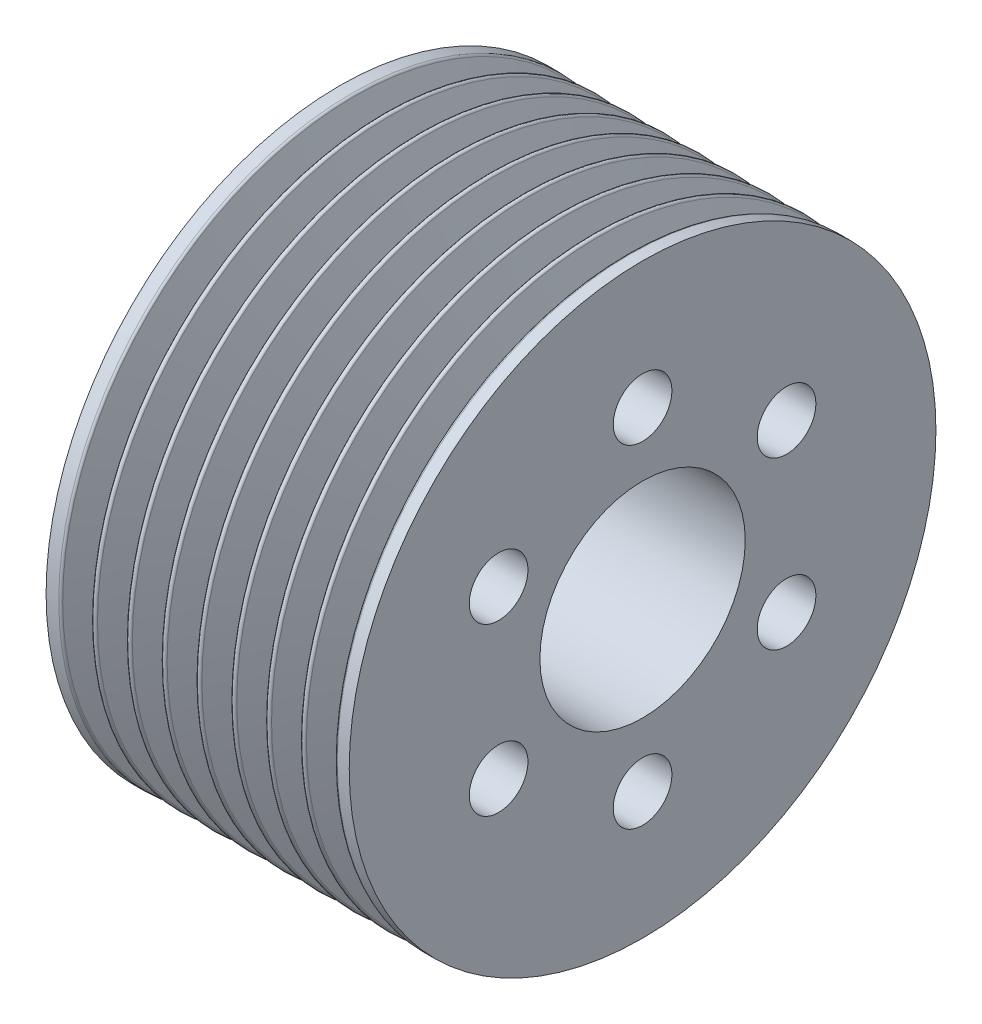
ISO-10303-21;
HEADER;
FILE_DESCRIPTION(('STEP AP214'),'2;1');
FILE_NAME('part.step','',(''),(''),'','','');
FILE_SCHEMA(('AUTOMOTIVE_DESIGN { 1 0 10303 214 1 1 1 1 }'));
ENDSEC;
DATA;
#1=APPLICATION_CONTEXT('core data for automotive mechanical design processes');
#2=APPLICATION_PROTOCOL_DEFINITION('international standard','automotive_design',2000,#1);
#3=PRODUCT_CONTEXT('',#1,'mechanical');
#4=PRODUCT('Part','Part','',(#3));
#5=PRODUCT_RELATED_PRODUCT_CATEGORY('part','',(#4));
#6=PRODUCT_DEFINITION_FORMATION('','',#4);
#7=PRODUCT_DEFINITION_CONTEXT('part definition',#1,'design');
#8=PRODUCT_DEFINITION('design','',#6,#7);
#9=PRODUCT_DEFINITION_SHAPE('','',#8);
#10=(LENGTH_UNIT() NAMED_UNIT(*) SI_UNIT(.MILLI.,.METRE.));
#11=(NAMED_UNIT(*) PLANE_ANGLE_UNIT() SI_UNIT($,.RADIAN.));
#12=(NAMED_UNIT(*) SI_UNIT($,.STERADIAN.) SOLID_ANGLE_UNIT());
#13=UNCERTAINTY_MEASURE_WITH_UNIT(LENGTH_MEASURE(1.E-05),#10,'distance_accuracy_value','');
#14=(GEOMETRIC_REPRESENTATION_CONTEXT(3) GLOBAL_UNCERTAINTY_ASSIGNED_CONTEXT((#13)) GLOBAL_UNIT_ASSIGNED_CONTEXT((#10,
#11,#12)) REPRESENTATION_CONTEXT('',''));
#15=CARTESIAN_POINT('',(0.,0.,0.));
#16=DIRECTION('',(0.,0.,1.));
#17=DIRECTION('',(1.,0.,0.));
#18=AXIS2_PLACEMENT_3D('',#15,#16,#17);
#19=CARTESIAN_POINT('',(0.,0.,0.));
#20=DIRECTION('',(-1.,0.,0.));
#21=DIRECTION('',(0.,0.,1.));
#22=AXIS2_PLACEMENT_3D('',#19,#20,#21);
#23=CYLINDRICAL_SURFACE('',#22,30.);
#24=CARTESIAN_POINT('',(18.,0.,0.));
#25=DIRECTION('',(-1.,0.,0.));
#26=DIRECTION('',(0.,0.,1.));
#27=AXIS2_PLACEMENT_3D('',#24,#25,#26);
#28=CIRCLE('',#27,30.);
#29=CARTESIAN_POINT('',(18.,0.,30.));
#30=VERTEX_POINT('',#29);
#31=EDGE_CURVE('E52',#30,#30,#28,.T.);
#32=ORIENTED_EDGE('',*,*,#31,.F.);
#33=EDGE_LOOP('',(#32));
#34=FACE_BOUND('',#33,.T.);
#35=CARTESIAN_POINT('',(19.3,0.,0.));
#36=DIRECTION('',(-1.,0.,0.));
#37=DIRECTION('',(0.,0.,1.));
#38=AXIS2_PLACEMENT_3D('',#35,#36,#37);
#39=CIRCLE('',#38,30.);
#40=CARTESIAN_POINT('',(19.3,0.,30.));
#41=VERTEX_POINT('',#40);
#42=EDGE_CURVE('E166',#41,#41,#39,.T.);
#43=ORIENTED_EDGE('',*,*,#42,.T.);
#44=EDGE_LOOP('',(#43));
#45=FACE_BOUND('',#44,.T.);
#46=ADVANCED_FACE('F41',(#34,#45),#23,.T.);
#47=CARTESIAN_POINT('',(31.5,10.5,0.));
#48=DIRECTION('',(1.,0.,0.));
#49=DIRECTION('',(0.,0.,-1.));
#50=AXIS2_PLACEMENT_3D('',#47,#48,#49);
#51=PLANE('',#50);
#52=CARTESIAN_POINT('',(31.5,8.50000000000017,14.7224318643354));
#53=DIRECTION('',(1.,0.,0.));
#54=DIRECTION('',(0.,0.,-1.));
#55=AXIS2_PLACEMENT_3D('',#52,#53,#54);
#56=CIRCLE('',#55,3.);
#57=CARTESIAN_POINT('',(31.5,8.50000000000017,11.7224318643354));
#58=VERTEX_POINT('',#57);
#59=EDGE_CURVE('E199',#58,#58,#56,.F.);
#60=ORIENTED_EDGE('',*,*,#59,.F.);
#61=EDGE_LOOP('',(#60));
#62=FACE_BOUND('',#61,.T.);
#63=CARTESIAN_POINT('',(31.5,-8.50000000000004,14.7224318643355));
#64=DIRECTION('',(1.,0.,0.));
#65=DIRECTION('',(0.,0.,-1.));
#66=AXIS2_PLACEMENT_3D('',#63,#64,#65);
#67=CIRCLE('',#66,3.);
#68=CARTESIAN_POINT('',(31.5,-8.50000000000004,11.7224318643355));
#69=VERTEX_POINT('',#68);
#70=EDGE_CURVE('E193',#69,#69,#67,.F.);
#71=ORIENTED_EDGE('',*,*,#70,.F.);
#72=EDGE_LOOP('',(#71));
#73=FACE_BOUND('',#72,.T.);
#74=CARTESIAN_POINT('',(31.5,-17.0000000000001,0.));
#75=DIRECTION('',(1.,0.,0.));
#76=DIRECTION('',(0.,0.,-1.));
#77=AXIS2_PLACEMENT_3D('',#74,#75,#76);
#78=CIRCLE('',#77,3.);
#79=CARTESIAN_POINT('',(31.5,-17.0000000000001,-2.99999999999996));
#80=VERTEX_POINT('',#79);
#81=EDGE_CURVE('E187',#80,#80,#78,.F.);
#82=ORIENTED_EDGE('',*,*,#81,.F.);
#83=EDGE_LOOP('',(#82));
#84=FACE_BOUND('',#83,.T.);
#85=CARTESIAN_POINT('',(31.5,-8.49999999999999,-14.7224318643355));
#86=DIRECTION('',(1.,0.,0.));
#87=DIRECTION('',(0.,0.,-1.));
#88=AXIS2_PLACEMENT_3D('',#85,#86,#87);
#89=CIRCLE('',#88,3.);
#90=CARTESIAN_POINT('',(31.5,-8.49999999999999,-17.7224318643355));
#91=VERTEX_POINT('',#90);
#92=EDGE_CURVE('E181',#91,#91,#89,.F.);
#93=ORIENTED_EDGE('',*,*,#92,.F.);
#94=EDGE_LOOP('',(#93));
#95=FACE_BOUND('',#94,.T.);
#96=CARTESIAN_POINT('',(31.5,8.5,-14.7224318643355));
#97=DIRECTION('',(1.,0.,0.));
#98=DIRECTION('',(0.,0.,-1.));
#99=AXIS2_PLACEMENT_3D('',#96,#97,#98);
#100=CIRCLE('',#99,3.);
#101=CARTESIAN_POINT('',(31.5,8.5,-17.7224318643355));
#102=VERTEX_POINT('',#101);
#103=EDGE_CURVE('E175',#102,#102,#100,.F.);
#104=ORIENTED_EDGE('',*,*,#103,.F.);
#105=EDGE_LOOP('',(#104));
#106=FACE_BOUND('',#105,.T.);
#107=CARTESIAN_POINT('',(31.5,17.,0.));
#108=DIRECTION('',(1.,0.,0.));
#109=DIRECTION('',(0.,0.,-1.));
#110=AXIS2_PLACEMENT_3D('',#107,#108,#109);
#111=CIRCLE('',#110,3.);
#112=CARTESIAN_POINT('',(31.5,17.,-3.));
#113=VERTEX_POINT('',#112);
#114=EDGE_CURVE('E169',#113,#113,#111,.F.);
#115=ORIENTED_EDGE('',*,*,#114,.F.);
#116=EDGE_LOOP('',(#115));
#117=FACE_BOUND('',#116,.T.);
#118=CARTESIAN_POINT('',(31.5,0.,0.));
#119=DIRECTION('',(-1.,0.,0.));
#120=DIRECTION('',(0.,0.,1.));
#121=AXIS2_PLACEMENT_3D('',#118,#119,#120);
#122=CIRCLE('',#121,10.5);
#123=CARTESIAN_POINT('',(31.5,0.,10.5));
#124=VERTEX_POINT('',#123);
#125=EDGE_CURVE('E64',#124,#124,#122,.T.);
#126=ORIENTED_EDGE('',*,*,#125,.F.);
#127=EDGE_LOOP('',(#126));
#128=FACE_BOUND('',#127,.T.);
#129=CARTESIAN_POINT('',(31.5,0.,0.));
#130=DIRECTION('',(-1.,0.,0.));
#131=DIRECTION('',(0.,0.,1.));
#132=AXIS2_PLACEMENT_3D('',#129,#130,#131);
#133=CIRCLE('',#132,21.5);
#134=CARTESIAN_POINT('',(31.5,0.,21.5));
#135=VERTEX_POINT('',#134);
#136=EDGE_CURVE('E10',#135,#135,#133,.T.);
#137=ORIENTED_EDGE('',*,*,#136,.T.);
#138=EDGE_LOOP('',(#137));
#139=FACE_BOUND('',#138,.T.);
#140=ADVANCED_FACE('F43',(#62,#73,#84,#95,#106,#117,#128,#139),#51,.F.);
#141=CARTESIAN_POINT('',(0.,0.,0.));
#142=DIRECTION('',(-1.,0.,0.));
#143=DIRECTION('',(0.,0.,1.));
#144=AXIS2_PLACEMENT_3D('',#141,#142,#143);
#145=CYLINDRICAL_SURFACE('',#144,21.5);
#146=ORIENTED_EDGE('',*,*,#136,.F.);
#147=EDGE_LOOP('',(#146));
#148=FACE_BOUND('',#147,.T.);
#149=CARTESIAN_POINT('',(18.,0.,0.));
#150=DIRECTION('',(-1.,0.,0.));
#151=DIRECTION('',(0.,0.,1.));
#152=AXIS2_PLACEMENT_3D('',#149,#150,#151);
#153=CIRCLE('',#152,21.5);
#154=CARTESIAN_POINT('',(18.,0.,21.5));
#155=VERTEX_POINT('',#154);
#156=EDGE_CURVE('E48',#155,#155,#153,.T.);
#157=ORIENTED_EDGE('',*,*,#156,.T.);
#158=EDGE_LOOP('',(#157));
#159=FACE_BOUND('',#158,.T.);
#160=ADVANCED_FACE('F235',(#148,#159),#145,.F.);
#161=CARTESIAN_POINT('',(18.,30.,0.));
#162=DIRECTION('',(1.,0.,0.));
#163=DIRECTION('',(0.,0.,-1.));
#164=AXIS2_PLACEMENT_3D('',#161,#162,#163);
#165=PLANE('',#164);
#166=ORIENTED_EDGE('',*,*,#156,.F.);
#167=EDGE_LOOP('',(#166));
#168=FACE_BOUND('',#167,.T.);
#169=ORIENTED_EDGE('',*,*,#31,.T.);
#170=EDGE_LOOP('',(#169));
#171=FACE_BOUND('',#170,.T.);
#172=ADVANCED_FACE('F241',(#168,#171),#165,.F.);
#173=CARTESIAN_POINT('',(47.78,0.,0.));
#174=DIRECTION('',(-1.,0.,0.));
#175=DIRECTION('',(0.,0.,1.));
#176=AXIS2_PLACEMENT_3D('',#173,#174,#175);
#177=CIRCLE('',#176,30.);
#178=CARTESIAN_POINT('',(47.78,0.,30.));
#179=VERTEX_POINT('',#178);
#180=EDGE_CURVE('E79',#179,#179,#177,.T.);
#181=ORIENTED_EDGE('',*,*,#180,.F.);
#182=EDGE_LOOP('',(#181));
#183=FACE_BOUND('',#182,.T.);
#184=CARTESIAN_POINT('',(49.,0.,0.));
#185=DIRECTION('',(-1.,0.,0.));
#186=DIRECTION('',(0.,0.,1.));
#187=AXIS2_PLACEMENT_3D('',#184,#185,#186);
#188=CIRCLE('',#187,30.);
#189=CARTESIAN_POINT('',(49.,0.,30.));
#190=VERTEX_POINT('',#189);
#191=EDGE_CURVE('E56',#190,#190,#188,.T.);
#192=ORIENTED_EDGE('',*,*,#191,.T.);
#193=EDGE_LOOP('',(#192));
#194=FACE_BOUND('',#193,.T.);
#195=ADVANCED_FACE('F212',(#183,#194),#23,.T.);
#196=CARTESIAN_POINT('',(49.,10.5,0.));
#197=DIRECTION('',(-1.,0.,0.));
#198=DIRECTION('',(0.,0.,1.));
#199=AXIS2_PLACEMENT_3D('',#196,#197,#198);
#200=PLANE('',#199);
#201=CARTESIAN_POINT('',(49.,8.50000000000017,14.7224318643354));
#202=DIRECTION('',(1.,0.,0.));
#203=DIRECTION('',(0.,0.,-1.));
#204=AXIS2_PLACEMENT_3D('',#201,#202,#203);
#205=CIRCLE('',#204,3.);
#206=CARTESIAN_POINT('',(49.,8.50000000000017,11.7224318643354));
#207=VERTEX_POINT('',#206);
#208=EDGE_CURVE('E202',#207,#207,#205,.T.);
#209=ORIENTED_EDGE('',*,*,#208,.F.);
#210=EDGE_LOOP('',(#209));
#211=FACE_BOUND('',#210,.T.);
#212=CARTESIAN_POINT('',(49.,-8.50000000000004,14.7224318643355));
#213=DIRECTION('',(1.,0.,0.));
#214=DIRECTION('',(0.,0.,-1.));
#215=AXIS2_PLACEMENT_3D('',#212,#213,#214);
#216=CIRCLE('',#215,3.);
#217=CARTESIAN_POINT('',(49.,-8.50000000000004,11.7224318643355));
#218=VERTEX_POINT('',#217);
#219=EDGE_CURVE('E196',#218,#218,#216,.T.);
#220=ORIENTED_EDGE('',*,*,#219,.F.);
#221=EDGE_LOOP('',(#220));
#222=FACE_BOUND('',#221,.T.);
#223=CARTESIAN_POINT('',(49.,-17.0000000000001,0.));
#224=DIRECTION('',(1.,0.,0.));
#225=DIRECTION('',(0.,0.,-1.));
#226=AXIS2_PLACEMENT_3D('',#223,#224,#225);
#227=CIRCLE('',#226,3.);
#228=CARTESIAN_POINT('',(49.,-17.0000000000001,-2.99999999999996));
#229=VERTEX_POINT('',#228);
#230=EDGE_CURVE('E190',#229,#229,#227,.T.);
#231=ORIENTED_EDGE('',*,*,#230,.F.);
#232=EDGE_LOOP('',(#231));
#233=FACE_BOUND('',#232,.T.);
#234=CARTESIAN_POINT('',(49.,-8.49999999999999,-14.7224318643355));
#235=DIRECTION('',(1.,0.,0.));
#236=DIRECTION('',(0.,0.,-1.));
#237=AXIS2_PLACEMENT_3D('',#234,#235,#236);
#238=CIRCLE('',#237,3.);
#239=CARTESIAN_POINT('',(49.,-8.49999999999999,-17.7224318643355));
#240=VERTEX_POINT('',#239);
#241=EDGE_CURVE('E184',#240,#240,#238,.T.);
#242=ORIENTED_EDGE('',*,*,#241,.F.);
#243=EDGE_LOOP('',(#242));
#244=FACE_BOUND('',#243,.T.);
#245=CARTESIAN_POINT('',(49.,8.5,-14.7224318643355));
#246=DIRECTION('',(1.,0.,0.));
#247=DIRECTION('',(0.,0.,-1.));
#248=AXIS2_PLACEMENT_3D('',#245,#246,#247);
#249=CIRCLE('',#248,3.);
#250=CARTESIAN_POINT('',(49.,8.5,-17.7224318643355));
#251=VERTEX_POINT('',#250);
#252=EDGE_CURVE('E178',#251,#251,#249,.T.);
#253=ORIENTED_EDGE('',*,*,#252,.F.);
#254=EDGE_LOOP('',(#253));
#255=FACE_BOUND('',#254,.T.);
#256=CARTESIAN_POINT('',(49.,17.,0.));
#257=DIRECTION('',(1.,0.,0.));
#258=DIRECTION('',(0.,0.,-1.));
#259=AXIS2_PLACEMENT_3D('',#256,#257,#258);
#260=CIRCLE('',#259,3.);
#261=CARTESIAN_POINT('',(49.,17.,-3.));
#262=VERTEX_POINT('',#261);
#263=EDGE_CURVE('E172',#262,#262,#260,.T.);
#264=ORIENTED_EDGE('',*,*,#263,.F.);
#265=EDGE_LOOP('',(#264));
#266=FACE_BOUND('',#265,.T.);
#267=ORIENTED_EDGE('',*,*,#191,.F.);
#268=EDGE_LOOP('',(#267));
#269=FACE_BOUND('',#268,.T.);
#270=CARTESIAN_POINT('',(49.,0.,0.));
#271=DIRECTION('',(-1.,0.,0.));
#272=DIRECTION('',(0.,0.,1.));
#273=AXIS2_PLACEMENT_3D('',#270,#271,#272);
#274=CIRCLE('',#273,10.5);
#275=CARTESIAN_POINT('',(49.,0.,10.5));
#276=VERTEX_POINT('',#275);
#277=EDGE_CURVE('E61',#276,#276,#274,.T.);
#278=ORIENTED_EDGE('',*,*,#277,.T.);
#279=EDGE_LOOP('',(#278));
#280=FACE_BOUND('',#279,.T.);
#281=ADVANCED_FACE('F208',(#211,#222,#233,#244,#255,#266,#269,#280),#200,.F.);
#282=CARTESIAN_POINT('',(0.,0.,0.));
#283=DIRECTION('',(-1.,0.,0.));
#284=DIRECTION('',(0.,0.,1.));
#285=AXIS2_PLACEMENT_3D('',#282,#283,#284);
#286=CYLINDRICAL_SURFACE('',#285,10.5);
#287=ORIENTED_EDGE('',*,*,#277,.F.);
#288=EDGE_LOOP('',(#287));
#289=FACE_BOUND('',#288,.T.);
#290=ORIENTED_EDGE('',*,*,#125,.T.);
#291=EDGE_LOOP('',(#290));
#292=FACE_BOUND('',#291,.T.);
#293=ADVANCED_FACE('F211',(#289,#292),#286,.F.);
#294=CARTESIAN_POINT('',(47.78,0.,0.));
#295=DIRECTION('',(-1.,0.,0.));
#296=DIRECTION('',(0.,0.,1.));
#297=AXIS2_PLACEMENT_3D('',#294,#295,#296);
#298=TOROIDAL_SURFACE('',#297,29.75,0.249999999999999);
#299=ORIENTED_EDGE('',*,*,#180,.T.);
#300=EDGE_LOOP('',(#299));
#301=FACE_BOUND('',#300,.T.);
#302=CARTESIAN_POINT('',(47.5450768448035,0.,0.));
#303=DIRECTION('',(-1.,0.,0.));
#304=DIRECTION('',(0.,0.,1.));
#305=AXIS2_PLACEMENT_3D('',#302,#303,#304);
#306=CIRCLE('',#305,29.8355050358314);
#307=CARTESIAN_POINT('',(47.5450768448035,0.,29.8355050358314));
#308=VERTEX_POINT('',#307);
#309=EDGE_CURVE('E67',#308,#308,#306,.T.);
#310=ORIENTED_EDGE('',*,*,#309,.F.);
#311=EDGE_LOOP('',(#310));
#312=FACE_BOUND('',#311,.T.);
#313=ADVANCED_FACE('F230',(#301,#312),#298,.T.);
#314=CARTESIAN_POINT('',(46.2819077862358,0.,0.));
#315=DIRECTION('',(1.,0.,0.));
#316=DIRECTION('',(0.,0.,-1.));
#317=AXIS2_PLACEMENT_3D('',#314,#315,#316);
#318=CONICAL_SURFACE('',#317,26.3649765704627,1.22173047639603);
#319=ORIENTED_EDGE('',*,*,#309,.T.);
#320=EDGE_LOOP('',(#319));
#321=FACE_BOUND('',#320,.T.);
#322=CARTESIAN_POINT('',(46.2819077862358,0.,0.));
#323=DIRECTION('',(-1.,0.,0.));
#324=DIRECTION('',(0.,0.,1.));
#325=AXIS2_PLACEMENT_3D('',#322,#323,#324);
#326=CIRCLE('',#325,26.3649765704627);
#327=CARTESIAN_POINT('',(46.2819077862358,0.,26.3649765704627));
#328=VERTEX_POINT('',#327);
#329=EDGE_CURVE('E70',#328,#328,#326,.T.);
#330=ORIENTED_EDGE('',*,*,#329,.F.);
#331=EDGE_LOOP('',(#330));
#332=FACE_BOUND('',#331,.T.);
#333=ADVANCED_FACE('F393',(#321,#332),#318,.T.);
#334=CARTESIAN_POINT('',(46.,0.,0.));
#335=DIRECTION('',(-1.,0.,0.));
#336=DIRECTION('',(0.,0.,1.));
#337=AXIS2_PLACEMENT_3D('',#334,#335,#336);
#338=TOROIDAL_SURFACE('',#337,26.4675826134604,0.3);
#339=ORIENTED_EDGE('',*,*,#329,.T.);
#340=EDGE_LOOP('',(#339));
#341=FACE_BOUND('',#340,.T.);
#342=CARTESIAN_POINT('',(45.7180922137642,0.,0.));
#343=DIRECTION('',(-1.,0.,0.));
#344=DIRECTION('',(0.,0.,1.));
#345=AXIS2_PLACEMENT_3D('',#342,#343,#344);
#346=CIRCLE('',#345,26.3649765704627);
#347=CARTESIAN_POINT('',(45.7180922137642,0.,26.3649765704627));
#348=VERTEX_POINT('',#347);
#349=EDGE_CURVE('E73',#348,#348,#346,.T.);
#350=ORIENTED_EDGE('',*,*,#349,.F.);
#351=EDGE_LOOP('',(#350));
#352=FACE_BOUND('',#351,.T.);
#353=ADVANCED_FACE('F389',(#341,#352),#338,.F.);
#354=CARTESIAN_POINT('',(44.4549231551965,0.,0.));
#355=DIRECTION('',(-1.,0.,0.));
#356=DIRECTION('',(0.,0.,1.));
#357=AXIS2_PLACEMENT_3D('',#354,#355,#356);
#358=CONICAL_SURFACE('',#357,29.8355050358314,1.22173047639604);
#359=ORIENTED_EDGE('',*,*,#349,.T.);
#360=EDGE_LOOP('',(#359));
#361=FACE_BOUND('',#360,.T.);
#362=CARTESIAN_POINT('',(44.4549231551965,0.,0.));
#363=DIRECTION('',(-1.,0.,0.));
#364=DIRECTION('',(0.,0.,1.));
#365=AXIS2_PLACEMENT_3D('',#362,#363,#364);
#366=CIRCLE('',#365,29.8355050358314);
#367=CARTESIAN_POINT('',(44.4549231551965,0.,29.8355050358314));
#368=VERTEX_POINT('',#367);
#369=EDGE_CURVE('E76',#368,#368,#366,.T.);
#370=ORIENTED_EDGE('',*,*,#369,.F.);
#371=EDGE_LOOP('',(#370));
#372=FACE_BOUND('',#371,.T.);
#373=ADVANCED_FACE('F385',(#361,#372),#358,.T.);
#374=CARTESIAN_POINT('',(44.22,0.,0.));
#375=DIRECTION('',(-1.,0.,0.));
#376=DIRECTION('',(0.,0.,1.));
#377=AXIS2_PLACEMENT_3D('',#374,#375,#376);
#378=TOROIDAL_SURFACE('',#377,29.75,0.250000000000001);
#379=ORIENTED_EDGE('',*,*,#369,.T.);
#380=EDGE_LOOP('',(#379));
#381=FACE_BOUND('',#380,.T.);
#382=CARTESIAN_POINT('',(43.9850768448035,0.,0.));
#383=DIRECTION('',(-1.,0.,0.));
#384=DIRECTION('',(0.,0.,1.));
#385=AXIS2_PLACEMENT_3D('',#382,#383,#384);
#386=CIRCLE('',#385,29.8355050358314);
#387=CARTESIAN_POINT('',(43.9850768448035,0.,29.8355050358314));
#388=VERTEX_POINT('',#387);
#389=EDGE_CURVE('E82',#388,#388,#386,.T.);
#390=ORIENTED_EDGE('',*,*,#389,.F.);
#391=EDGE_LOOP('',(#390));
#392=FACE_BOUND('',#391,.T.);
#393=ADVANCED_FACE('F381',(#381,#392),#378,.T.);
#394=CARTESIAN_POINT('',(42.7219077862358,0.,0.));
#395=DIRECTION('',(1.,0.,0.));
#396=DIRECTION('',(0.,0.,-1.));
#397=AXIS2_PLACEMENT_3D('',#394,#395,#396);
#398=CONICAL_SURFACE('',#397,26.3649765704627,1.22173047639603);
#399=ORIENTED_EDGE('',*,*,#389,.T.);
#400=EDGE_LOOP('',(#399));
#401=FACE_BOUND('',#400,.T.);
#402=CARTESIAN_POINT('',(42.7219077862358,0.,0.));
#403=DIRECTION('',(-1.,0.,0.));
#404=DIRECTION('',(0.,0.,1.));
#405=AXIS2_PLACEMENT_3D('',#402,#403,#404);
#406=CIRCLE('',#405,26.3649765704627);
#407=CARTESIAN_POINT('',(42.7219077862358,0.,26.3649765704627));
#408=VERTEX_POINT('',#407);
#409=EDGE_CURVE('E85',#408,#408,#406,.T.);
#410=ORIENTED_EDGE('',*,*,#409,.F.);
#411=EDGE_LOOP('',(#410));
#412=FACE_BOUND('',#411,.T.);
#413=ADVANCED_FACE('F377',(#401,#412),#398,.T.);
#414=CARTESIAN_POINT('',(42.44,0.,0.));
#415=DIRECTION('',(-1.,0.,0.));
#416=DIRECTION('',(0.,0.,1.));
#417=AXIS2_PLACEMENT_3D('',#414,#415,#416);
#418=TOROIDAL_SURFACE('',#417,26.4675826134604,0.3);
#419=ORIENTED_EDGE('',*,*,#409,.T.);
#420=EDGE_LOOP('',(#419));
#421=FACE_BOUND('',#420,.T.);
#422=CARTESIAN_POINT('',(42.1580922137642,0.,0.));
#423=DIRECTION('',(-1.,0.,0.));
#424=DIRECTION('',(0.,0.,1.));
#425=AXIS2_PLACEMENT_3D('',#422,#423,#424);
#426=CIRCLE('',#425,26.3649765704627);
#427=CARTESIAN_POINT('',(42.1580922137642,0.,26.3649765704627));
#428=VERTEX_POINT('',#427);
#429=EDGE_CURVE('E88',#428,#428,#426,.T.);
#430=ORIENTED_EDGE('',*,*,#429,.F.);
#431=EDGE_LOOP('',(#430));
#432=FACE_BOUND('',#431,.T.);
#433=ADVANCED_FACE('F373',(#421,#432),#418,.F.);
#434=CARTESIAN_POINT('',(40.8949231551965,0.,0.));
#435=DIRECTION('',(-1.,0.,0.));
#436=DIRECTION('',(0.,0.,1.));
#437=AXIS2_PLACEMENT_3D('',#434,#435,#436);
#438=CONICAL_SURFACE('',#437,29.8355050358314,1.22173047639604);
#439=ORIENTED_EDGE('',*,*,#429,.T.);
#440=EDGE_LOOP('',(#439));
#441=FACE_BOUND('',#440,.T.);
#442=CARTESIAN_POINT('',(40.8949231551965,0.,0.));
#443=DIRECTION('',(-1.,0.,0.));
#444=DIRECTION('',(0.,0.,1.));
#445=AXIS2_PLACEMENT_3D('',#442,#443,#444);
#446=CIRCLE('',#445,29.8355050358314);
#447=CARTESIAN_POINT('',(40.8949231551965,0.,29.8355050358314));
#448=VERTEX_POINT('',#447);
#449=EDGE_CURVE('E91',#448,#448,#446,.T.);
#450=ORIENTED_EDGE('',*,*,#449,.F.);
#451=EDGE_LOOP('',(#450));
#452=FACE_BOUND('',#451,.T.);
#453=ADVANCED_FACE('F369',(#441,#452),#438,.T.);
#454=CARTESIAN_POINT('',(40.66,0.,0.));
#455=DIRECTION('',(-1.,0.,0.));
#456=DIRECTION('',(0.,0.,1.));
#457=AXIS2_PLACEMENT_3D('',#454,#455,#456);
#458=TOROIDAL_SURFACE('',#457,29.75,0.250000000000001);
#459=ORIENTED_EDGE('',*,*,#449,.T.);
#460=EDGE_LOOP('',(#459));
#461=FACE_BOUND('',#460,.T.);
#462=CARTESIAN_POINT('',(40.4250768448035,0.,0.));
#463=DIRECTION('',(-1.,0.,0.));
#464=DIRECTION('',(0.,0.,1.));
#465=AXIS2_PLACEMENT_3D('',#462,#463,#464);
#466=CIRCLE('',#465,29.8355050358314);
#467=CARTESIAN_POINT('',(40.4250768448035,0.,29.8355050358314));
#468=VERTEX_POINT('',#467);
#469=EDGE_CURVE('E94',#468,#468,#466,.T.);
#470=ORIENTED_EDGE('',*,*,#469,.F.);
#471=EDGE_LOOP('',(#470));
#472=FACE_BOUND('',#471,.T.);
#473=ADVANCED_FACE('F365',(#461,#472),#458,.T.);
#474=CARTESIAN_POINT('',(39.1619077862358,0.,0.));
#475=DIRECTION('',(1.,0.,0.));
#476=DIRECTION('',(0.,0.,-1.));
#477=AXIS2_PLACEMENT_3D('',#474,#475,#476);
#478=CONICAL_SURFACE('',#477,26.3649765704627,1.22173047639603);
#479=ORIENTED_EDGE('',*,*,#469,.T.);
#480=EDGE_LOOP('',(#479));
#481=FACE_BOUND('',#480,.T.);
#482=CARTESIAN_POINT('',(39.1619077862358,0.,0.));
#483=DIRECTION('',(-1.,0.,0.));
#484=DIRECTION('',(0.,0.,1.));
#485=AXIS2_PLACEMENT_3D('',#482,#483,#484);
#486=CIRCLE('',#485,26.3649765704627);
#487=CARTESIAN_POINT('',(39.1619077862358,0.,26.3649765704627));
#488=VERTEX_POINT('',#487);
#489=EDGE_CURVE('E97',#488,#488,#486,.T.);
#490=ORIENTED_EDGE('',*,*,#489,.F.);
#491=EDGE_LOOP('',(#490));
#492=FACE_BOUND('',#491,.T.);
#493=ADVANCED_FACE('F361',(#481,#492),#478,.T.);
#494=CARTESIAN_POINT('',(38.88,0.,0.));
#495=DIRECTION('',(-1.,0.,0.));
#496=DIRECTION('',(0.,0.,1.));
#497=AXIS2_PLACEMENT_3D('',#494,#495,#496);
#498=TOROIDAL_SURFACE('',#497,26.4675826134604,0.3);
#499=ORIENTED_EDGE('',*,*,#489,.T.);
#500=EDGE_LOOP('',(#499));
#501=FACE_BOUND('',#500,.T.);
#502=CARTESIAN_POINT('',(38.5980922137642,0.,0.));
#503=DIRECTION('',(-1.,0.,0.));
#504=DIRECTION('',(0.,0.,1.));
#505=AXIS2_PLACEMENT_3D('',#502,#503,#504);
#506=CIRCLE('',#505,26.3649765704627);
#507=CARTESIAN_POINT('',(38.5980922137642,0.,26.3649765704627));
#508=VERTEX_POINT('',#507);
#509=EDGE_CURVE('E100',#508,#508,#506,.T.);
#510=ORIENTED_EDGE('',*,*,#509,.F.);
#511=EDGE_LOOP('',(#510));
#512=FACE_BOUND('',#511,.T.);
#513=ADVANCED_FACE('F357',(#501,#512),#498,.F.);
#514=CARTESIAN_POINT('',(37.3349231551965,0.,0.));
#515=DIRECTION('',(-1.,0.,0.));
#516=DIRECTION('',(0.,0.,1.));
#517=AXIS2_PLACEMENT_3D('',#514,#515,#516);
#518=CONICAL_SURFACE('',#517,29.8355050358314,1.22173047639604);
#519=ORIENTED_EDGE('',*,*,#509,.T.);
#520=EDGE_LOOP('',(#519));
#521=FACE_BOUND('',#520,.T.);
#522=CARTESIAN_POINT('',(37.3349231551965,0.,0.));
#523=DIRECTION('',(-1.,0.,0.));
#524=DIRECTION('',(0.,0.,1.));
#525=AXIS2_PLACEMENT_3D('',#522,#523,#524);
#526=CIRCLE('',#525,29.8355050358314);
#527=CARTESIAN_POINT('',(37.3349231551965,0.,29.8355050358314));
#528=VERTEX_POINT('',#527);
#529=EDGE_CURVE('E103',#528,#528,#526,.T.);
#530=ORIENTED_EDGE('',*,*,#529,.F.);
#531=EDGE_LOOP('',(#530));
#532=FACE_BOUND('',#531,.T.);
#533=ADVANCED_FACE('F353',(#521,#532),#518,.T.);
#534=CARTESIAN_POINT('',(37.1,0.,0.));
#535=DIRECTION('',(-1.,0.,0.));
#536=DIRECTION('',(0.,0.,1.));
#537=AXIS2_PLACEMENT_3D('',#534,#535,#536);
#538=TOROIDAL_SURFACE('',#537,29.75,0.250000000000001);
#539=ORIENTED_EDGE('',*,*,#529,.T.);
#540=EDGE_LOOP('',(#539));
#541=FACE_BOUND('',#540,.T.);
#542=CARTESIAN_POINT('',(36.8650768448035,0.,0.));
#543=DIRECTION('',(-1.,0.,0.));
#544=DIRECTION('',(0.,0.,1.));
#545=AXIS2_PLACEMENT_3D('',#542,#543,#544);
#546=CIRCLE('',#545,29.8355050358314);
#547=CARTESIAN_POINT('',(36.8650768448035,0.,29.8355050358314));
#548=VERTEX_POINT('',#547);
#549=EDGE_CURVE('E106',#548,#548,#546,.T.);
#550=ORIENTED_EDGE('',*,*,#549,.F.);
#551=EDGE_LOOP('',(#550));
#552=FACE_BOUND('',#551,.T.);
#553=ADVANCED_FACE('F349',(#541,#552),#538,.T.);
#554=CARTESIAN_POINT('',(35.6019077862358,0.,0.));
#555=DIRECTION('',(1.,0.,0.));
#556=DIRECTION('',(0.,0.,-1.));
#557=AXIS2_PLACEMENT_3D('',#554,#555,#556);
#558=CONICAL_SURFACE('',#557,26.3649765704627,1.22173047639603);
#559=ORIENTED_EDGE('',*,*,#549,.T.);
#560=EDGE_LOOP('',(#559));
#561=FACE_BOUND('',#560,.T.);
#562=CARTESIAN_POINT('',(35.6019077862358,0.,0.));
#563=DIRECTION('',(-1.,0.,0.));
#564=DIRECTION('',(0.,0.,1.));
#565=AXIS2_PLACEMENT_3D('',#562,#563,#564);
#566=CIRCLE('',#565,26.3649765704627);
#567=CARTESIAN_POINT('',(35.6019077862358,0.,26.3649765704627));
#568=VERTEX_POINT('',#567);
#569=EDGE_CURVE('E109',#568,#568,#566,.T.);
#570=ORIENTED_EDGE('',*,*,#569,.F.);
#571=EDGE_LOOP('',(#570));
#572=FACE_BOUND('',#571,.T.);
#573=ADVANCED_FACE('F345',(#561,#572),#558,.T.);
#574=CARTESIAN_POINT('',(35.32,0.,0.));
#575=DIRECTION('',(-1.,0.,0.));
#576=DIRECTION('',(0.,0.,1.));
#577=AXIS2_PLACEMENT_3D('',#574,#575,#576);
#578=TOROIDAL_SURFACE('',#577,26.4675826134604,0.3);
#579=ORIENTED_EDGE('',*,*,#569,.T.);
#580=EDGE_LOOP('',(#579));
#581=FACE_BOUND('',#580,.T.);
#582=CARTESIAN_POINT('',(35.0380922137642,0.,0.));
#583=DIRECTION('',(-1.,0.,0.));
#584=DIRECTION('',(0.,0.,1.));
#585=AXIS2_PLACEMENT_3D('',#582,#583,#584);
#586=CIRCLE('',#585,26.3649765704627);
#587=CARTESIAN_POINT('',(35.0380922137642,0.,26.3649765704627));
#588=VERTEX_POINT('',#587);
#589=EDGE_CURVE('E112',#588,#588,#586,.T.);
#590=ORIENTED_EDGE('',*,*,#589,.F.);
#591=EDGE_LOOP('',(#590));
#592=FACE_BOUND('',#591,.T.);
#593=ADVANCED_FACE('F341',(#581,#592),#578,.F.);
#594=CARTESIAN_POINT('',(33.7749231551965,0.,0.));
#595=DIRECTION('',(-1.,0.,0.));
#596=DIRECTION('',(0.,0.,1.));
#597=AXIS2_PLACEMENT_3D('',#594,#595,#596);
#598=CONICAL_SURFACE('',#597,29.8355050358314,1.22173047639604);
#599=ORIENTED_EDGE('',*,*,#589,.T.);
#600=EDGE_LOOP('',(#599));
#601=FACE_BOUND('',#600,.T.);
#602=CARTESIAN_POINT('',(33.7749231551965,0.,0.));
#603=DIRECTION('',(-1.,0.,0.));
#604=DIRECTION('',(0.,0.,1.));
#605=AXIS2_PLACEMENT_3D('',#602,#603,#604);
#606=CIRCLE('',#605,29.8355050358314);
#607=CARTESIAN_POINT('',(33.7749231551965,0.,29.8355050358314));
#608=VERTEX_POINT('',#607);
#609=EDGE_CURVE('E115',#608,#608,#606,.T.);
#610=ORIENTED_EDGE('',*,*,#609,.F.);
#611=EDGE_LOOP('',(#610));
#612=FACE_BOUND('',#611,.T.);
#613=ADVANCED_FACE('F337',(#601,#612),#598,.T.);
#614=CARTESIAN_POINT('',(33.54,0.,0.));
#615=DIRECTION('',(-1.,0.,0.));
#616=DIRECTION('',(0.,0.,1.));
#617=AXIS2_PLACEMENT_3D('',#614,#615,#616);
#618=TOROIDAL_SURFACE('',#617,29.75,0.250000000000001);
#619=ORIENTED_EDGE('',*,*,#609,.T.);
#620=EDGE_LOOP('',(#619));
#621=FACE_BOUND('',#620,.T.);
#622=CARTESIAN_POINT('',(33.3050768448035,0.,0.));
#623=DIRECTION('',(-1.,0.,0.));
#624=DIRECTION('',(0.,0.,1.));
#625=AXIS2_PLACEMENT_3D('',#622,#623,#624);
#626=CIRCLE('',#625,29.8355050358314);
#627=CARTESIAN_POINT('',(33.3050768448035,0.,29.8355050358314));
#628=VERTEX_POINT('',#627);
#629=EDGE_CURVE('E118',#628,#628,#626,.T.);
#630=ORIENTED_EDGE('',*,*,#629,.F.);
#631=EDGE_LOOP('',(#630));
#632=FACE_BOUND('',#631,.T.);
#633=ADVANCED_FACE('F333',(#621,#632),#618,.T.);
#634=CARTESIAN_POINT('',(32.0419077862358,0.,0.));
#635=DIRECTION('',(1.,0.,0.));
#636=DIRECTION('',(0.,0.,-1.));
#637=AXIS2_PLACEMENT_3D('',#634,#635,#636);
#638=CONICAL_SURFACE('',#637,26.3649765704627,1.22173047639603);
#639=ORIENTED_EDGE('',*,*,#629,.T.);
#640=EDGE_LOOP('',(#639));
#641=FACE_BOUND('',#640,.T.);
#642=CARTESIAN_POINT('',(32.0419077862358,0.,0.));
#643=DIRECTION('',(-1.,0.,0.));
#644=DIRECTION('',(0.,0.,1.));
#645=AXIS2_PLACEMENT_3D('',#642,#643,#644);
#646=CIRCLE('',#645,26.3649765704627);
#647=CARTESIAN_POINT('',(32.0419077862358,0.,26.3649765704627));
#648=VERTEX_POINT('',#647);
#649=EDGE_CURVE('E121',#648,#648,#646,.T.);
#650=ORIENTED_EDGE('',*,*,#649,.F.);
#651=EDGE_LOOP('',(#650));
#652=FACE_BOUND('',#651,.T.);
#653=ADVANCED_FACE('F329',(#641,#652),#638,.T.);
#654=CARTESIAN_POINT('',(31.76,0.,0.));
#655=DIRECTION('',(-1.,0.,0.));
#656=DIRECTION('',(0.,0.,1.));
#657=AXIS2_PLACEMENT_3D('',#654,#655,#656);
#658=TOROIDAL_SURFACE('',#657,26.4675826134604,0.3);
#659=ORIENTED_EDGE('',*,*,#649,.T.);
#660=EDGE_LOOP('',(#659));
#661=FACE_BOUND('',#660,.T.);
#662=CARTESIAN_POINT('',(31.4780922137642,0.,0.));
#663=DIRECTION('',(-1.,0.,0.));
#664=DIRECTION('',(0.,0.,1.));
#665=AXIS2_PLACEMENT_3D('',#662,#663,#664);
#666=CIRCLE('',#665,26.3649765704627);
#667=CARTESIAN_POINT('',(31.4780922137642,0.,26.3649765704627));
#668=VERTEX_POINT('',#667);
#669=EDGE_CURVE('E124',#668,#668,#666,.T.);
#670=ORIENTED_EDGE('',*,*,#669,.F.);
#671=EDGE_LOOP('',(#670));
#672=FACE_BOUND('',#671,.T.);
#673=ADVANCED_FACE('F325',(#661,#672),#658,.F.);
#674=CARTESIAN_POINT('',(30.2149231551965,0.,0.));
#675=DIRECTION('',(-1.,0.,0.));
#676=DIRECTION('',(0.,0.,1.));
#677=AXIS2_PLACEMENT_3D('',#674,#675,#676);
#678=CONICAL_SURFACE('',#677,29.8355050358314,1.22173047639604);
#679=ORIENTED_EDGE('',*,*,#669,.T.);
#680=EDGE_LOOP('',(#679));
#681=FACE_BOUND('',#680,.T.);
#682=CARTESIAN_POINT('',(30.2149231551965,0.,0.));
#683=DIRECTION('',(-1.,0.,0.));
#684=DIRECTION('',(0.,0.,1.));
#685=AXIS2_PLACEMENT_3D('',#682,#683,#684);
#686=CIRCLE('',#685,29.8355050358314);
#687=CARTESIAN_POINT('',(30.2149231551965,0.,29.8355050358314));
#688=VERTEX_POINT('',#687);
#689=EDGE_CURVE('E127',#688,#688,#686,.T.);
#690=ORIENTED_EDGE('',*,*,#689,.F.);
#691=EDGE_LOOP('',(#690));
#692=FACE_BOUND('',#691,.T.);
#693=ADVANCED_FACE('F321',(#681,#692),#678,.T.);
#694=CARTESIAN_POINT('',(29.98,0.,0.));
#695=DIRECTION('',(-1.,0.,0.));
#696=DIRECTION('',(0.,0.,1.));
#697=AXIS2_PLACEMENT_3D('',#694,#695,#696);
#698=TOROIDAL_SURFACE('',#697,29.75,0.250000000000001);
#699=ORIENTED_EDGE('',*,*,#689,.T.);
#700=EDGE_LOOP('',(#699));
#701=FACE_BOUND('',#700,.T.);
#702=CARTESIAN_POINT('',(29.7450768448035,0.,0.));
#703=DIRECTION('',(-1.,0.,0.));
#704=DIRECTION('',(0.,0.,1.));
#705=AXIS2_PLACEMENT_3D('',#702,#703,#704);
#706=CIRCLE('',#705,29.8355050358314);
#707=CARTESIAN_POINT('',(29.7450768448035,0.,29.8355050358314));
#708=VERTEX_POINT('',#707);
#709=EDGE_CURVE('E130',#708,#708,#706,.T.);
#710=ORIENTED_EDGE('',*,*,#709,.F.);
#711=EDGE_LOOP('',(#710));
#712=FACE_BOUND('',#711,.T.);
#713=ADVANCED_FACE('F317',(#701,#712),#698,.T.);
#714=CARTESIAN_POINT('',(28.4819077862358,0.,0.));
#715=DIRECTION('',(1.,0.,0.));
#716=DIRECTION('',(0.,0.,-1.));
#717=AXIS2_PLACEMENT_3D('',#714,#715,#716);
#718=CONICAL_SURFACE('',#717,26.3649765704627,1.22173047639603);
#719=ORIENTED_EDGE('',*,*,#709,.T.);
#720=EDGE_LOOP('',(#719));
#721=FACE_BOUND('',#720,.T.);
#722=CARTESIAN_POINT('',(28.4819077862358,0.,0.));
#723=DIRECTION('',(-1.,0.,0.));
#724=DIRECTION('',(0.,0.,1.));
#725=AXIS2_PLACEMENT_3D('',#722,#723,#724);
#726=CIRCLE('',#725,26.3649765704627);
#727=CARTESIAN_POINT('',(28.4819077862358,0.,26.3649765704627));
#728=VERTEX_POINT('',#727);
#729=EDGE_CURVE('E133',#728,#728,#726,.T.);
#730=ORIENTED_EDGE('',*,*,#729,.F.);
#731=EDGE_LOOP('',(#730));
#732=FACE_BOUND('',#731,.T.);
#733=ADVANCED_FACE('F313',(#721,#732),#718,.T.);
#734=CARTESIAN_POINT('',(28.2,0.,0.));
#735=DIRECTION('',(-1.,0.,0.));
#736=DIRECTION('',(0.,0.,1.));
#737=AXIS2_PLACEMENT_3D('',#734,#735,#736);
#738=TOROIDAL_SURFACE('',#737,26.4675826134604,0.3);
#739=ORIENTED_EDGE('',*,*,#729,.T.);
#740=EDGE_LOOP('',(#739));
#741=FACE_BOUND('',#740,.T.);
#742=CARTESIAN_POINT('',(27.9180922137642,0.,0.));
#743=DIRECTION('',(-1.,0.,0.));
#744=DIRECTION('',(0.,0.,1.));
#745=AXIS2_PLACEMENT_3D('',#742,#743,#744);
#746=CIRCLE('',#745,26.3649765704627);
#747=CARTESIAN_POINT('',(27.9180922137642,0.,26.3649765704627));
#748=VERTEX_POINT('',#747);
#749=EDGE_CURVE('E136',#748,#748,#746,.T.);
#750=ORIENTED_EDGE('',*,*,#749,.F.);
#751=EDGE_LOOP('',(#750));
#752=FACE_BOUND('',#751,.T.);
#753=ADVANCED_FACE('F309',(#741,#752),#738,.F.);
#754=CARTESIAN_POINT('',(26.6549231551965,0.,0.));
#755=DIRECTION('',(-1.,0.,0.));
#756=DIRECTION('',(0.,0.,1.));
#757=AXIS2_PLACEMENT_3D('',#754,#755,#756);
#758=CONICAL_SURFACE('',#757,29.8355050358314,1.22173047639604);
#759=ORIENTED_EDGE('',*,*,#749,.T.);
#760=EDGE_LOOP('',(#759));
#761=FACE_BOUND('',#760,.T.);
#762=CARTESIAN_POINT('',(26.6549231551965,0.,0.));
#763=DIRECTION('',(-1.,0.,0.));
#764=DIRECTION('',(0.,0.,1.));
#765=AXIS2_PLACEMENT_3D('',#762,#763,#764);
#766=CIRCLE('',#765,29.8355050358314);
#767=CARTESIAN_POINT('',(26.6549231551965,0.,29.8355050358314));
#768=VERTEX_POINT('',#767);
#769=EDGE_CURVE('E139',#768,#768,#766,.T.);
#770=ORIENTED_EDGE('',*,*,#769,.F.);
#771=EDGE_LOOP('',(#770));
#772=FACE_BOUND('',#771,.T.);
#773=ADVANCED_FACE('F305',(#761,#772),#758,.T.);
#774=CARTESIAN_POINT('',(26.42,0.,0.));
#775=DIRECTION('',(-1.,0.,0.));
#776=DIRECTION('',(0.,0.,1.));
#777=AXIS2_PLACEMENT_3D('',#774,#775,#776);
#778=TOROIDAL_SURFACE('',#777,29.75,0.250000000000001);
#779=ORIENTED_EDGE('',*,*,#769,.T.);
#780=EDGE_LOOP('',(#779));
#781=FACE_BOUND('',#780,.T.);
#782=CARTESIAN_POINT('',(26.1850768448035,0.,0.));
#783=DIRECTION('',(-1.,0.,0.));
#784=DIRECTION('',(0.,0.,1.));
#785=AXIS2_PLACEMENT_3D('',#782,#783,#784);
#786=CIRCLE('',#785,29.8355050358314);
#787=CARTESIAN_POINT('',(26.1850768448035,0.,29.8355050358314));
#788=VERTEX_POINT('',#787);
#789=EDGE_CURVE('E142',#788,#788,#786,.T.);
#790=ORIENTED_EDGE('',*,*,#789,.F.);
#791=EDGE_LOOP('',(#790));
#792=FACE_BOUND('',#791,.T.);
#793=ADVANCED_FACE('F301',(#781,#792),#778,.T.);
#794=CARTESIAN_POINT('',(24.9219077862358,0.,0.));
#795=DIRECTION('',(1.,0.,0.));
#796=DIRECTION('',(0.,0.,-1.));
#797=AXIS2_PLACEMENT_3D('',#794,#795,#796);
#798=CONICAL_SURFACE('',#797,26.3649765704627,1.22173047639603);
#799=ORIENTED_EDGE('',*,*,#789,.T.);
#800=EDGE_LOOP('',(#799));
#801=FACE_BOUND('',#800,.T.);
#802=CARTESIAN_POINT('',(24.9219077862358,0.,0.));
#803=DIRECTION('',(-1.,0.,0.));
#804=DIRECTION('',(0.,0.,1.));
#805=AXIS2_PLACEMENT_3D('',#802,#803,#804);
#806=CIRCLE('',#805,26.3649765704627);
#807=CARTESIAN_POINT('',(24.9219077862358,0.,26.3649765704627));
#808=VERTEX_POINT('',#807);
#809=EDGE_CURVE('E145',#808,#808,#806,.T.);
#810=ORIENTED_EDGE('',*,*,#809,.F.);
#811=EDGE_LOOP('',(#810));
#812=FACE_BOUND('',#811,.T.);
#813=ADVANCED_FACE('F297',(#801,#812),#798,.T.);
#814=CARTESIAN_POINT('',(24.64,0.,0.));
#815=DIRECTION('',(-1.,0.,0.));
#816=DIRECTION('',(0.,0.,1.));
#817=AXIS2_PLACEMENT_3D('',#814,#815,#816);
#818=TOROIDAL_SURFACE('',#817,26.4675826134604,0.3);
#819=ORIENTED_EDGE('',*,*,#809,.T.);
#820=EDGE_LOOP('',(#819));
#821=FACE_BOUND('',#820,.T.);
#822=CARTESIAN_POINT('',(24.3580922137642,0.,0.));
#823=DIRECTION('',(-1.,0.,0.));
#824=DIRECTION('',(0.,0.,1.));
#825=AXIS2_PLACEMENT_3D('',#822,#823,#824);
#826=CIRCLE('',#825,26.3649765704627);
#827=CARTESIAN_POINT('',(24.3580922137642,0.,26.3649765704627));
#828=VERTEX_POINT('',#827);
#829=EDGE_CURVE('E148',#828,#828,#826,.T.);
#830=ORIENTED_EDGE('',*,*,#829,.F.);
#831=EDGE_LOOP('',(#830));
#832=FACE_BOUND('',#831,.T.);
#833=ADVANCED_FACE('F293',(#821,#832),#818,.F.);
#834=CARTESIAN_POINT('',(23.0949231551965,0.,0.));
#835=DIRECTION('',(-1.,0.,0.));
#836=DIRECTION('',(0.,0.,1.));
#837=AXIS2_PLACEMENT_3D('',#834,#835,#836);
#838=CONICAL_SURFACE('',#837,29.8355050358314,1.22173047639604);
#839=ORIENTED_EDGE('',*,*,#829,.T.);
#840=EDGE_LOOP('',(#839));
#841=FACE_BOUND('',#840,.T.);
#842=CARTESIAN_POINT('',(23.0949231551965,0.,0.));
#843=DIRECTION('',(-1.,0.,0.));
#844=DIRECTION('',(0.,0.,1.));
#845=AXIS2_PLACEMENT_3D('',#842,#843,#844);
#846=CIRCLE('',#845,29.8355050358314);
#847=CARTESIAN_POINT('',(23.0949231551965,0.,29.8355050358314));
#848=VERTEX_POINT('',#847);
#849=EDGE_CURVE('E151',#848,#848,#846,.T.);
#850=ORIENTED_EDGE('',*,*,#849,.F.);
#851=EDGE_LOOP('',(#850));
#852=FACE_BOUND('',#851,.T.);
#853=ADVANCED_FACE('F289',(#841,#852),#838,.T.);
#854=CARTESIAN_POINT('',(22.86,0.,0.));
#855=DIRECTION('',(-1.,0.,0.));
#856=DIRECTION('',(0.,0.,1.));
#857=AXIS2_PLACEMENT_3D('',#854,#855,#856);
#858=TOROIDAL_SURFACE('',#857,29.75,0.250000000000001);
#859=ORIENTED_EDGE('',*,*,#849,.T.);
#860=EDGE_LOOP('',(#859));
#861=FACE_BOUND('',#860,.T.);
#862=CARTESIAN_POINT('',(22.6250768448035,0.,0.));
#863=DIRECTION('',(-1.,0.,0.));
#864=DIRECTION('',(0.,0.,1.));
#865=AXIS2_PLACEMENT_3D('',#862,#863,#864);
#866=CIRCLE('',#865,29.8355050358314);
#867=CARTESIAN_POINT('',(22.6250768448035,0.,29.8355050358314));
#868=VERTEX_POINT('',#867);
#869=EDGE_CURVE('E154',#868,#868,#866,.T.);
#870=ORIENTED_EDGE('',*,*,#869,.F.);
#871=EDGE_LOOP('',(#870));
#872=FACE_BOUND('',#871,.T.);
#873=ADVANCED_FACE('F285',(#861,#872),#858,.T.);
#874=CARTESIAN_POINT('',(21.3619077862358,0.,0.));
#875=DIRECTION('',(1.,0.,0.));
#876=DIRECTION('',(0.,0.,-1.));
#877=AXIS2_PLACEMENT_3D('',#874,#875,#876);
#878=CONICAL_SURFACE('',#877,26.3649765704627,1.22173047639603);
#879=ORIENTED_EDGE('',*,*,#869,.T.);
#880=EDGE_LOOP('',(#879));
#881=FACE_BOUND('',#880,.T.);
#882=CARTESIAN_POINT('',(21.3619077862358,0.,0.));
#883=DIRECTION('',(-1.,0.,0.));
#884=DIRECTION('',(0.,0.,1.));
#885=AXIS2_PLACEMENT_3D('',#882,#883,#884);
#886=CIRCLE('',#885,26.3649765704627);
#887=CARTESIAN_POINT('',(21.3619077862358,0.,26.3649765704627));
#888=VERTEX_POINT('',#887);
#889=EDGE_CURVE('E157',#888,#888,#886,.T.);
#890=ORIENTED_EDGE('',*,*,#889,.F.);
#891=EDGE_LOOP('',(#890));
#892=FACE_BOUND('',#891,.T.);
#893=ADVANCED_FACE('F281',(#881,#892),#878,.T.);
#894=CARTESIAN_POINT('',(21.08,0.,0.));
#895=DIRECTION('',(-1.,0.,0.));
#896=DIRECTION('',(0.,0.,1.));
#897=AXIS2_PLACEMENT_3D('',#894,#895,#896);
#898=TOROIDAL_SURFACE('',#897,26.4675826134604,0.3);
#899=ORIENTED_EDGE('',*,*,#889,.T.);
#900=EDGE_LOOP('',(#899));
#901=FACE_BOUND('',#900,.T.);
#902=CARTESIAN_POINT('',(20.7980922137642,0.,0.));
#903=DIRECTION('',(-1.,0.,0.));
#904=DIRECTION('',(0.,0.,1.));
#905=AXIS2_PLACEMENT_3D('',#902,#903,#904);
#906=CIRCLE('',#905,26.3649765704627);
#907=CARTESIAN_POINT('',(20.7980922137642,0.,26.3649765704627));
#908=VERTEX_POINT('',#907);
#909=EDGE_CURVE('E160',#908,#908,#906,.T.);
#910=ORIENTED_EDGE('',*,*,#909,.F.);
#911=EDGE_LOOP('',(#910));
#912=FACE_BOUND('',#911,.T.);
#913=ADVANCED_FACE('F277',(#901,#912),#898,.F.);
#914=CARTESIAN_POINT('',(19.5349231551965,0.,0.));
#915=DIRECTION('',(-1.,0.,0.));
#916=DIRECTION('',(0.,0.,1.));
#917=AXIS2_PLACEMENT_3D('',#914,#915,#916);
#918=CONICAL_SURFACE('',#917,29.8355050358314,1.22173047639604);
#919=ORIENTED_EDGE('',*,*,#909,.T.);
#920=EDGE_LOOP('',(#919));
#921=FACE_BOUND('',#920,.T.);
#922=CARTESIAN_POINT('',(19.5349231551965,0.,0.));
#923=DIRECTION('',(-1.,0.,0.));
#924=DIRECTION('',(0.,0.,1.));
#925=AXIS2_PLACEMENT_3D('',#922,#923,#924);
#926=CIRCLE('',#925,29.8355050358314);
#927=CARTESIAN_POINT('',(19.5349231551965,0.,29.8355050358314));
#928=VERTEX_POINT('',#927);
#929=EDGE_CURVE('E163',#928,#928,#926,.T.);
#930=ORIENTED_EDGE('',*,*,#929,.F.);
#931=EDGE_LOOP('',(#930));
#932=FACE_BOUND('',#931,.T.);
#933=ADVANCED_FACE('F270',(#921,#932),#918,.T.);
#934=CARTESIAN_POINT('',(19.3,0.,0.));
#935=DIRECTION('',(-1.,0.,0.));
#936=DIRECTION('',(0.,0.,1.));
#937=AXIS2_PLACEMENT_3D('',#934,#935,#936);
#938=TOROIDAL_SURFACE('',#937,29.75,0.250000000000001);
#939=ORIENTED_EDGE('',*,*,#929,.T.);
#940=EDGE_LOOP('',(#939));
#941=FACE_BOUND('',#940,.T.);
#942=ORIENTED_EDGE('',*,*,#42,.F.);
#943=EDGE_LOOP('',(#942));
#944=FACE_BOUND('',#943,.T.);
#945=ADVANCED_FACE('F261',(#941,#944),#938,.T.);
#946=CARTESIAN_POINT('',(23.0147186257614,17.,0.));
#947=DIRECTION('',(1.,0.,0.));
#948=DIRECTION('',(0.,0.,-1.));
#949=AXIS2_PLACEMENT_3D('',#946,#947,#948);
#950=CYLINDRICAL_SURFACE('',#949,3.);
#951=ORIENTED_EDGE('',*,*,#114,.T.);
#952=EDGE_LOOP('',(#951));
#953=FACE_BOUND('',#952,.T.);
#954=ORIENTED_EDGE('',*,*,#263,.T.);
#955=EDGE_LOOP('',(#954));
#956=FACE_BOUND('',#955,.T.);
#957=ADVANCED_FACE('F257',(#953,#956),#950,.F.);
#958=CARTESIAN_POINT('',(23.0147186257614,8.5,-14.7224318643355));
#959=DIRECTION('',(1.,0.,0.));
#960=DIRECTION('',(0.,0.,-1.));
#961=AXIS2_PLACEMENT_3D('',#958,#959,#960);
#962=CYLINDRICAL_SURFACE('',#961,3.);
#963=ORIENTED_EDGE('',*,*,#103,.T.);
#964=EDGE_LOOP('',(#963));
#965=FACE_BOUND('',#964,.T.);
#966=ORIENTED_EDGE('',*,*,#252,.T.);
#967=EDGE_LOOP('',(#966));
#968=FACE_BOUND('',#967,.T.);
#969=ADVANCED_FACE('F260',(#965,#968),#962,.F.);
#970=CARTESIAN_POINT('',(23.0147186257614,-8.49999999999999,-14.7224318643355));
#971=DIRECTION('',(1.,0.,0.));
#972=DIRECTION('',(0.,0.,-1.));
#973=AXIS2_PLACEMENT_3D('',#970,#971,#972);
#974=CYLINDRICAL_SURFACE('',#973,3.);
#975=ORIENTED_EDGE('',*,*,#92,.T.);
#976=EDGE_LOOP('',(#975));
#977=FACE_BOUND('',#976,.T.);
#978=ORIENTED_EDGE('',*,*,#241,.T.);
#979=EDGE_LOOP('',(#978));
#980=FACE_BOUND('',#979,.T.);
#981=ADVANCED_FACE('F267',(#977,#980),#974,.F.);
#982=CARTESIAN_POINT('',(23.0147186257614,-17.0000000000001,0.));
#983=DIRECTION('',(1.,0.,0.));
#984=DIRECTION('',(0.,0.,-1.));
#985=AXIS2_PLACEMENT_3D('',#982,#983,#984);
#986=CYLINDRICAL_SURFACE('',#985,3.);
#987=ORIENTED_EDGE('',*,*,#81,.T.);
#988=EDGE_LOOP('',(#987));
#989=FACE_BOUND('',#988,.T.);
#990=ORIENTED_EDGE('',*,*,#230,.T.);
#991=EDGE_LOOP('',(#990));
#992=FACE_BOUND('',#991,.T.);
#993=ADVANCED_FACE('F537',(#989,#992),#986,.F.);
#994=CARTESIAN_POINT('',(23.0147186257614,-8.50000000000004,14.7224318643355));
#995=DIRECTION('',(1.,0.,0.));
#996=DIRECTION('',(0.,0.,-1.));
#997=AXIS2_PLACEMENT_3D('',#994,#995,#996);
#998=CYLINDRICAL_SURFACE('',#997,3.);
#999=ORIENTED_EDGE('',*,*,#70,.T.);
#1000=EDGE_LOOP('',(#999));
#1001=FACE_BOUND('',#1000,.T.);
#1002=ORIENTED_EDGE('',*,*,#219,.T.);
#1003=EDGE_LOOP('',(#1002));
#1004=FACE_BOUND('',#1003,.T.);
#1005=ADVANCED_FACE('F545',(#1001,#1004),#998,.F.);
#1006=CARTESIAN_POINT('',(23.0147186257614,8.50000000000017,14.7224318643354));
#1007=DIRECTION('',(1.,0.,0.));
#1008=DIRECTION('',(0.,0.,-1.));
#1009=AXIS2_PLACEMENT_3D('',#1006,#1007,#1008);
#1010=CYLINDRICAL_SURFACE('',#1009,3.);
#1011=ORIENTED_EDGE('',*,*,#59,.T.);
#1012=EDGE_LOOP('',(#1011));
#1013=FACE_BOUND('',#1012,.T.);
#1014=ORIENTED_EDGE('',*,*,#208,.T.);
#1015=EDGE_LOOP('',(#1014));
#1016=FACE_BOUND('',#1015,.T.);
#1017=ADVANCED_FACE('F206',(#1013,#1016),#1010,.F.);
#1018=CLOSED_SHELL('',(#46,#140,#160,#172,#195,#281,#293,#313,#333,#353,#373,#393,#413,#433,
#453,#473,#493,#513,#533,#553,#573,#593,#613,#633,#653,#673,#693,#713,#733,#753,#773,#793,#813,
#833,#853,#873,#893,#913,#933,#945,#957,#969,#981,#993,#1005,#1017));
#1019=MANIFOLD_SOLID_BREP('B2',#1018);
#1020=ADVANCED_BREP_SHAPE_REPRESENTATION('',(#18,#1019),#14);
#1021=SHAPE_DEFINITION_REPRESENTATION(#9,#1020);
ENDSEC;
END-ISO-10303-21;
